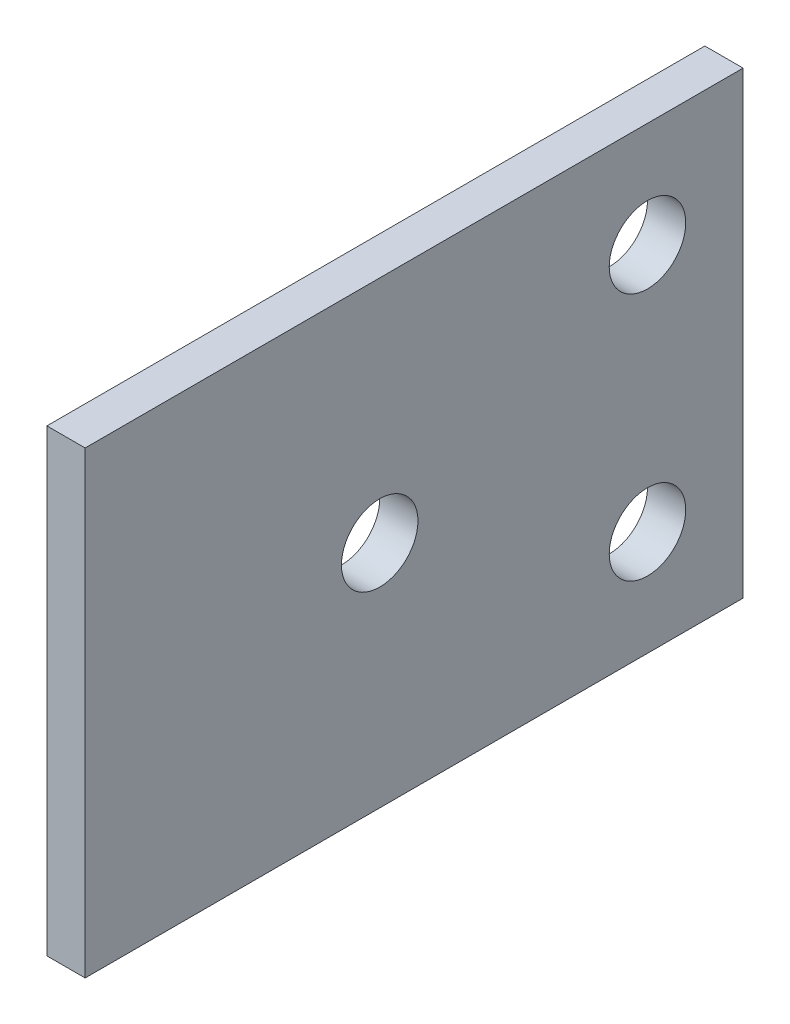
ISO-10303-21;
HEADER;
FILE_DESCRIPTION(('STEP AP214'),'2;1');
FILE_NAME('part.step','',(''),(''),'','','');
FILE_SCHEMA(('AUTOMOTIVE_DESIGN { 1 0 10303 214 1 1 1 1 }'));
ENDSEC;
DATA;
#1=APPLICATION_CONTEXT('core data for automotive mechanical design processes');
#2=APPLICATION_PROTOCOL_DEFINITION('international standard','automotive_design',2000,#1);
#3=PRODUCT_CONTEXT('',#1,'mechanical');
#4=PRODUCT('Part','Part','',(#3));
#5=PRODUCT_RELATED_PRODUCT_CATEGORY('part','',(#4));
#6=PRODUCT_DEFINITION_FORMATION('','',#4);
#7=PRODUCT_DEFINITION_CONTEXT('part definition',#1,'design');
#8=PRODUCT_DEFINITION('design','',#6,#7);
#9=PRODUCT_DEFINITION_SHAPE('','',#8);
#10=(LENGTH_UNIT() NAMED_UNIT(*) SI_UNIT(.MILLI.,.METRE.));
#11=(NAMED_UNIT(*) PLANE_ANGLE_UNIT() SI_UNIT($,.RADIAN.));
#12=(NAMED_UNIT(*) SI_UNIT($,.STERADIAN.) SOLID_ANGLE_UNIT());
#13=UNCERTAINTY_MEASURE_WITH_UNIT(LENGTH_MEASURE(1.E-05),#10,'distance_accuracy_value','');
#14=(GEOMETRIC_REPRESENTATION_CONTEXT(3) GLOBAL_UNCERTAINTY_ASSIGNED_CONTEXT((#13)) GLOBAL_UNIT_ASSIGNED_CONTEXT((#10,
#11,#12)) REPRESENTATION_CONTEXT('',''));
#15=CARTESIAN_POINT('',(0.,0.,0.));
#16=DIRECTION('',(0.,0.,1.));
#17=DIRECTION('',(1.,0.,0.));
#18=AXIS2_PLACEMENT_3D('',#15,#16,#17);
#19=CARTESIAN_POINT('',(10.,-60.,-86.));
#20=DIRECTION('',(0.,0.,1.));
#21=DIRECTION('',(1.,0.,0.));
#22=AXIS2_PLACEMENT_3D('',#19,#20,#21);
#23=PLANE('',#22);
#24=DIRECTION('',(0.,1.,0.));
#25=VECTOR('',#24,1.);
#26=CARTESIAN_POINT('',(0.,-60.,-86.));
#27=LINE('',#26,#25);
#28=CARTESIAN_POINT('',(0.,-60.,-86.));
#29=VERTEX_POINT('',#28);
#30=CARTESIAN_POINT('',(0.,60.,-86.));
#31=VERTEX_POINT('',#30);
#32=EDGE_CURVE('E96',#29,#31,#27,.T.);
#33=ORIENTED_EDGE('',*,*,#32,.T.);
#34=DIRECTION('',(-1.,0.,0.));
#35=VECTOR('',#34,1.);
#36=CARTESIAN_POINT('',(10.,60.,-86.));
#37=LINE('',#36,#35);
#38=CARTESIAN_POINT('',(10.,60.,-86.));
#39=VERTEX_POINT('',#38);
#40=EDGE_CURVE('E11',#39,#31,#37,.T.);
#41=ORIENTED_EDGE('',*,*,#40,.F.);
#42=DIRECTION('',(0.,1.,0.));
#43=VECTOR('',#42,1.);
#44=CARTESIAN_POINT('',(10.,-60.,-86.));
#45=LINE('',#44,#43);
#46=CARTESIAN_POINT('',(10.,-60.,-86.));
#47=VERTEX_POINT('',#46);
#48=EDGE_CURVE('E84',#47,#39,#45,.T.);
#49=ORIENTED_EDGE('',*,*,#48,.F.);
#50=DIRECTION('',(-1.,0.,0.));
#51=VECTOR('',#50,1.);
#52=CARTESIAN_POINT('',(10.,-60.,-86.));
#53=LINE('',#52,#51);
#54=EDGE_CURVE('E92',#47,#29,#53,.T.);
#55=ORIENTED_EDGE('',*,*,#54,.T.);
#56=EDGE_LOOP('',(#33,#41,#49,#55));
#57=FACE_BOUND('',#56,.T.);
#58=ADVANCED_FACE('F33',(#57),#23,.F.);
#59=CARTESIAN_POINT('',(10.,60.,86.));
#60=DIRECTION('',(0.,-1.,0.));
#61=DIRECTION('',(0.,0.,-1.));
#62=AXIS2_PLACEMENT_3D('',#59,#60,#61);
#63=PLANE('',#62);
#64=DIRECTION('',(0.,0.,1.));
#65=VECTOR('',#64,1.);
#66=CARTESIAN_POINT('',(0.,60.,86.));
#67=LINE('',#66,#65);
#68=CARTESIAN_POINT('',(0.,60.,86.));
#69=VERTEX_POINT('',#68);
#70=EDGE_CURVE('E88',#31,#69,#67,.T.);
#71=ORIENTED_EDGE('',*,*,#70,.T.);
#72=DIRECTION('',(-1.,0.,0.));
#73=VECTOR('',#72,1.);
#74=CARTESIAN_POINT('',(10.,60.,86.));
#75=LINE('',#74,#73);
#76=CARTESIAN_POINT('',(10.,60.,86.));
#77=VERTEX_POINT('',#76);
#78=EDGE_CURVE('E41',#77,#69,#75,.T.);
#79=ORIENTED_EDGE('',*,*,#78,.F.);
#80=DIRECTION('',(0.,0.,1.));
#81=VECTOR('',#80,1.);
#82=CARTESIAN_POINT('',(10.,60.,86.));
#83=LINE('',#82,#81);
#84=EDGE_CURVE('E79',#39,#77,#83,.T.);
#85=ORIENTED_EDGE('',*,*,#84,.F.);
#86=ORIENTED_EDGE('',*,*,#40,.T.);
#87=EDGE_LOOP('',(#71,#79,#85,#86));
#88=FACE_BOUND('',#87,.T.);
#89=ADVANCED_FACE('F87',(#88),#63,.F.);
#90=CARTESIAN_POINT('',(10.,-60.,86.));
#91=DIRECTION('',(0.,0.,-1.));
#92=DIRECTION('',(-1.,0.,0.));
#93=AXIS2_PLACEMENT_3D('',#90,#91,#92);
#94=PLANE('',#93);
#95=DIRECTION('',(0.,-1.,0.));
#96=VECTOR('',#95,1.);
#97=CARTESIAN_POINT('',(0.,-60.,86.));
#98=LINE('',#97,#96);
#99=CARTESIAN_POINT('',(0.,-60.,86.));
#100=VERTEX_POINT('',#99);
#101=EDGE_CURVE('E66',#69,#100,#98,.T.);
#102=ORIENTED_EDGE('',*,*,#101,.T.);
#103=DIRECTION('',(-1.,0.,0.));
#104=VECTOR('',#103,1.);
#105=CARTESIAN_POINT('',(10.,-60.,86.));
#106=LINE('',#105,#104);
#107=CARTESIAN_POINT('',(10.,-60.,86.));
#108=VERTEX_POINT('',#107);
#109=EDGE_CURVE('E89',#108,#100,#106,.T.);
#110=ORIENTED_EDGE('',*,*,#109,.F.);
#111=DIRECTION('',(0.,-1.,0.));
#112=VECTOR('',#111,1.);
#113=CARTESIAN_POINT('',(10.,-60.,86.));
#114=LINE('',#113,#112);
#115=EDGE_CURVE('E82',#77,#108,#114,.T.);
#116=ORIENTED_EDGE('',*,*,#115,.F.);
#117=ORIENTED_EDGE('',*,*,#78,.T.);
#118=EDGE_LOOP('',(#102,#110,#116,#117));
#119=FACE_BOUND('',#118,.T.);
#120=ADVANCED_FACE('F90',(#119),#94,.F.);
#121=CARTESIAN_POINT('',(10.,-60.,86.));
#122=DIRECTION('',(0.,1.,0.));
#123=DIRECTION('',(0.,0.,1.));
#124=AXIS2_PLACEMENT_3D('',#121,#122,#123);
#125=PLANE('',#124);
#126=DIRECTION('',(0.,0.,-1.));
#127=VECTOR('',#126,1.);
#128=CARTESIAN_POINT('',(0.,-60.,86.));
#129=LINE('',#128,#127);
#130=EDGE_CURVE('E72',#100,#29,#129,.T.);
#131=ORIENTED_EDGE('',*,*,#130,.T.);
#132=ORIENTED_EDGE('',*,*,#54,.F.);
#133=DIRECTION('',(0.,0.,-1.));
#134=VECTOR('',#133,1.);
#135=CARTESIAN_POINT('',(10.,-60.,86.));
#136=LINE('',#135,#134);
#137=EDGE_CURVE('E49',#108,#47,#136,.T.);
#138=ORIENTED_EDGE('',*,*,#137,.F.);
#139=ORIENTED_EDGE('',*,*,#109,.T.);
#140=EDGE_LOOP('',(#131,#132,#138,#139));
#141=FACE_BOUND('',#140,.T.);
#142=ADVANCED_FACE('F104',(#141),#125,.F.);
#143=CARTESIAN_POINT('',(10.,0.,0.));
#144=DIRECTION('',(-1.,0.,0.));
#145=DIRECTION('',(0.,0.,1.));
#146=AXIS2_PLACEMENT_3D('',#143,#144,#145);
#147=PLANE('',#146);
#148=CARTESIAN_POINT('',(10.,32.5,-61.));
#149=DIRECTION('',(-1.,0.,0.));
#150=DIRECTION('',(0.,0.,1.));
#151=AXIS2_PLACEMENT_3D('',#148,#149,#150);
#152=CIRCLE('',#151,10.);
#153=CARTESIAN_POINT('',(10.,32.5,-51.));
#154=VERTEX_POINT('',#153);
#155=EDGE_CURVE('E115',#154,#154,#152,.T.);
#156=ORIENTED_EDGE('',*,*,#155,.T.);
#157=EDGE_LOOP('',(#156));
#158=FACE_BOUND('',#157,.T.);
#159=CARTESIAN_POINT('',(10.,-32.5,-61.));
#160=DIRECTION('',(-1.,0.,0.));
#161=DIRECTION('',(0.,0.,1.));
#162=AXIS2_PLACEMENT_3D('',#159,#160,#161);
#163=CIRCLE('',#162,10.);
#164=CARTESIAN_POINT('',(10.,-32.5,-51.));
#165=VERTEX_POINT('',#164);
#166=EDGE_CURVE('E118',#165,#165,#163,.T.);
#167=ORIENTED_EDGE('',*,*,#166,.T.);
#168=EDGE_LOOP('',(#167));
#169=FACE_BOUND('',#168,.T.);
#170=CARTESIAN_POINT('',(10.,0.,8.99999999999999));
#171=DIRECTION('',(-1.,0.,0.));
#172=DIRECTION('',(0.,0.,1.));
#173=AXIS2_PLACEMENT_3D('',#170,#171,#172);
#174=CIRCLE('',#173,10.);
#175=CARTESIAN_POINT('',(10.,0.,19.));
#176=VERTEX_POINT('',#175);
#177=EDGE_CURVE('E99',#176,#176,#174,.T.);
#178=ORIENTED_EDGE('',*,*,#177,.T.);
#179=EDGE_LOOP('',(#178));
#180=FACE_BOUND('',#179,.T.);
#181=ORIENTED_EDGE('',*,*,#48,.T.);
#182=ORIENTED_EDGE('',*,*,#84,.T.);
#183=ORIENTED_EDGE('',*,*,#115,.T.);
#184=ORIENTED_EDGE('',*,*,#137,.T.);
#185=EDGE_LOOP('',(#181,#182,#183,#184));
#186=FACE_BOUND('',#185,.T.);
#187=ADVANCED_FACE('F80',(#158,#169,#180,#186),#147,.F.);
#188=CARTESIAN_POINT('',(0.,0.,0.));
#189=DIRECTION('',(-1.,0.,0.));
#190=DIRECTION('',(0.,0.,1.));
#191=AXIS2_PLACEMENT_3D('',#188,#189,#190);
#192=PLANE('',#191);
#193=CARTESIAN_POINT('',(0.,32.5,-61.));
#194=DIRECTION('',(1.,0.,0.));
#195=DIRECTION('',(0.,0.,-1.));
#196=AXIS2_PLACEMENT_3D('',#193,#194,#195);
#197=CIRCLE('',#196,10.);
#198=CARTESIAN_POINT('',(0.,32.5,-71.));
#199=VERTEX_POINT('',#198);
#200=EDGE_CURVE('E121',#199,#199,#197,.T.);
#201=ORIENTED_EDGE('',*,*,#200,.T.);
#202=EDGE_LOOP('',(#201));
#203=FACE_BOUND('',#202,.T.);
#204=CARTESIAN_POINT('',(0.,-32.5,-61.));
#205=DIRECTION('',(1.,0.,0.));
#206=DIRECTION('',(0.,0.,-1.));
#207=AXIS2_PLACEMENT_3D('',#204,#205,#206);
#208=CIRCLE('',#207,10.);
#209=CARTESIAN_POINT('',(0.,-32.5,-71.));
#210=VERTEX_POINT('',#209);
#211=EDGE_CURVE('E122',#210,#210,#208,.T.);
#212=ORIENTED_EDGE('',*,*,#211,.T.);
#213=EDGE_LOOP('',(#212));
#214=FACE_BOUND('',#213,.T.);
#215=CARTESIAN_POINT('',(0.,0.,8.99999999999999));
#216=DIRECTION('',(1.,0.,0.));
#217=DIRECTION('',(0.,0.,-1.));
#218=AXIS2_PLACEMENT_3D('',#215,#216,#217);
#219=CIRCLE('',#218,10.);
#220=CARTESIAN_POINT('',(0.,0.,-1.00000000000001));
#221=VERTEX_POINT('',#220);
#222=EDGE_CURVE('E112',#221,#221,#219,.T.);
#223=ORIENTED_EDGE('',*,*,#222,.T.);
#224=EDGE_LOOP('',(#223));
#225=FACE_BOUND('',#224,.T.);
#226=ORIENTED_EDGE('',*,*,#32,.F.);
#227=ORIENTED_EDGE('',*,*,#130,.F.);
#228=ORIENTED_EDGE('',*,*,#101,.F.);
#229=ORIENTED_EDGE('',*,*,#70,.F.);
#230=EDGE_LOOP('',(#226,#227,#228,#229));
#231=FACE_BOUND('',#230,.T.);
#232=ADVANCED_FACE('F107',(#203,#214,#225,#231),#192,.T.);
#233=CARTESIAN_POINT('',(0.,0.,8.99999999999999));
#234=DIRECTION('',(1.,0.,0.));
#235=DIRECTION('',(0.,0.,-1.));
#236=AXIS2_PLACEMENT_3D('',#233,#234,#235);
#237=CYLINDRICAL_SURFACE('',#236,10.);
#238=ORIENTED_EDGE('',*,*,#222,.F.);
#239=EDGE_LOOP('',(#238));
#240=FACE_BOUND('',#239,.T.);
#241=ORIENTED_EDGE('',*,*,#177,.F.);
#242=EDGE_LOOP('',(#241));
#243=FACE_BOUND('',#242,.T.);
#244=ADVANCED_FACE('F144',(#240,#243),#237,.F.);
#245=CARTESIAN_POINT('',(0.,-32.5,-61.));
#246=DIRECTION('',(1.,0.,0.));
#247=DIRECTION('',(0.,0.,-1.));
#248=AXIS2_PLACEMENT_3D('',#245,#246,#247);
#249=CYLINDRICAL_SURFACE('',#248,10.);
#250=ORIENTED_EDGE('',*,*,#211,.F.);
#251=EDGE_LOOP('',(#250));
#252=FACE_BOUND('',#251,.T.);
#253=ORIENTED_EDGE('',*,*,#166,.F.);
#254=EDGE_LOOP('',(#253));
#255=FACE_BOUND('',#254,.T.);
#256=ADVANCED_FACE('F133',(#252,#255),#249,.F.);
#257=CARTESIAN_POINT('',(0.,32.5,-61.));
#258=DIRECTION('',(1.,0.,0.));
#259=DIRECTION('',(0.,0.,-1.));
#260=AXIS2_PLACEMENT_3D('',#257,#258,#259);
#261=CYLINDRICAL_SURFACE('',#260,10.);
#262=ORIENTED_EDGE('',*,*,#200,.F.);
#263=EDGE_LOOP('',(#262));
#264=FACE_BOUND('',#263,.T.);
#265=ORIENTED_EDGE('',*,*,#155,.F.);
#266=EDGE_LOOP('',(#265));
#267=FACE_BOUND('',#266,.T.);
#268=ADVANCED_FACE('F130',(#264,#267),#261,.F.);
#269=CLOSED_SHELL('',(#58,#89,#120,#142,#187,#232,#244,#256,#268));
#270=MANIFOLD_SOLID_BREP('B2',#269);
#271=ADVANCED_BREP_SHAPE_REPRESENTATION('',(#18,#270),#14);
#272=SHAPE_DEFINITION_REPRESENTATION(#9,#271);
ENDSEC;
END-ISO-10303-21;
